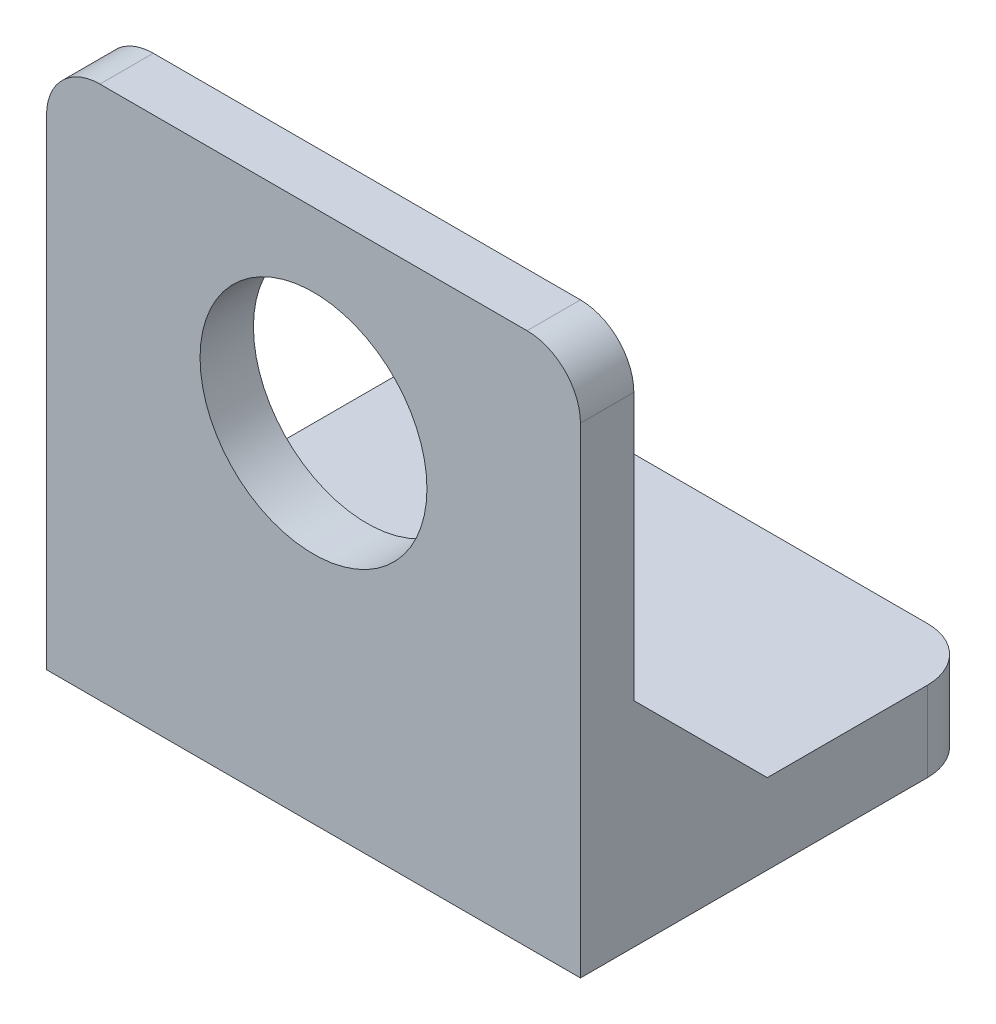
ISO-10303-21;
HEADER;
FILE_DESCRIPTION(('STEP AP214'),'2;1');
FILE_NAME('part.step','',(''),(''),'','','');
FILE_SCHEMA(('AUTOMOTIVE_DESIGN { 1 0 10303 214 1 1 1 1 }'));
ENDSEC;
DATA;
#1=APPLICATION_CONTEXT('core data for automotive mechanical design processes');
#2=APPLICATION_PROTOCOL_DEFINITION('international standard','automotive_design',2000,#1);
#3=PRODUCT_CONTEXT('',#1,'mechanical');
#4=PRODUCT('Part','Part','',(#3));
#5=PRODUCT_RELATED_PRODUCT_CATEGORY('part','',(#4));
#6=PRODUCT_DEFINITION_FORMATION('','',#4);
#7=PRODUCT_DEFINITION_CONTEXT('part definition',#1,'design');
#8=PRODUCT_DEFINITION('design','',#6,#7);
#9=PRODUCT_DEFINITION_SHAPE('','',#8);
#10=(LENGTH_UNIT() NAMED_UNIT(*) SI_UNIT(.MILLI.,.METRE.));
#11=(NAMED_UNIT(*) PLANE_ANGLE_UNIT() SI_UNIT($,.RADIAN.));
#12=(NAMED_UNIT(*) SI_UNIT($,.STERADIAN.) SOLID_ANGLE_UNIT());
#13=UNCERTAINTY_MEASURE_WITH_UNIT(LENGTH_MEASURE(1.E-05),#10,'distance_accuracy_value','');
#14=(GEOMETRIC_REPRESENTATION_CONTEXT(3) GLOBAL_UNCERTAINTY_ASSIGNED_CONTEXT((#13)) GLOBAL_UNIT_ASSIGNED_CONTEXT((#10,
#11,#12)) REPRESENTATION_CONTEXT('',''));
#15=CARTESIAN_POINT('',(0.,0.,0.));
#16=DIRECTION('',(0.,0.,1.));
#17=DIRECTION('',(1.,0.,0.));
#18=AXIS2_PLACEMENT_3D('',#15,#16,#17);
#19=CARTESIAN_POINT('',(0.,0.,-2.));
#20=DIRECTION('',(0.,0.,1.));
#21=DIRECTION('',(1.,0.,0.));
#22=AXIS2_PLACEMENT_3D('',#19,#20,#21);
#23=PLANE('',#22);
#24=CARTESIAN_POINT('',(0.,0.,-2.));
#25=DIRECTION('',(0.,0.,1.));
#26=DIRECTION('',(1.,0.,0.));
#27=AXIS2_PLACEMENT_3D('',#24,#25,#26);
#28=CIRCLE('',#27,4.25);
#29=CARTESIAN_POINT('',(4.25,0.,-2.));
#30=VERTEX_POINT('',#29);
#31=EDGE_CURVE('E231',#30,#30,#28,.T.);
#32=ORIENTED_EDGE('',*,*,#31,.T.);
#33=EDGE_LOOP('',(#32));
#34=FACE_BOUND('',#33,.T.);
#35=DIRECTION('',(0.,-1.,0.));
#36=VECTOR('',#35,1.);
#37=CARTESIAN_POINT('',(-10.,7.,-2.));
#38=LINE('',#37,#36);
#39=CARTESIAN_POINT('',(-10.,5.,-2.));
#40=VERTEX_POINT('',#39);
#41=CARTESIAN_POINT('',(-10.,-5.,-2.));
#42=VERTEX_POINT('',#41);
#43=EDGE_CURVE('E238',#40,#42,#38,.T.);
#44=ORIENTED_EDGE('',*,*,#43,.F.);
#45=CARTESIAN_POINT('',(-8.,5.,-2.));
#46=DIRECTION('',(0.,0.,1.));
#47=DIRECTION('',(1.,0.,0.));
#48=AXIS2_PLACEMENT_3D('',#45,#46,#47);
#49=CIRCLE('',#48,2.);
#50=CARTESIAN_POINT('',(-8.,7.,-2.));
#51=VERTEX_POINT('',#50);
#52=EDGE_CURVE('E190',#40,#51,#49,.F.);
#53=ORIENTED_EDGE('',*,*,#52,.T.);
#54=DIRECTION('',(-1.,0.,0.));
#55=VECTOR('',#54,1.);
#56=CARTESIAN_POINT('',(-10.,7.,-2.));
#57=LINE('',#56,#55);
#58=CARTESIAN_POINT('',(8.,7.,-2.));
#59=VERTEX_POINT('',#58);
#60=EDGE_CURVE('E247',#59,#51,#57,.T.);
#61=ORIENTED_EDGE('',*,*,#60,.F.);
#62=CARTESIAN_POINT('',(8.,5.,-2.));
#63=DIRECTION('',(0.,0.,1.));
#64=DIRECTION('',(1.,0.,0.));
#65=AXIS2_PLACEMENT_3D('',#62,#63,#64);
#66=CIRCLE('',#65,2.);
#67=CARTESIAN_POINT('',(10.,5.,-2.));
#68=VERTEX_POINT('',#67);
#69=EDGE_CURVE('E183',#59,#68,#66,.F.);
#70=ORIENTED_EDGE('',*,*,#69,.T.);
#71=DIRECTION('',(0.,1.,0.));
#72=VECTOR('',#71,1.);
#73=CARTESIAN_POINT('',(10.,7.,-2.));
#74=LINE('',#73,#72);
#75=CARTESIAN_POINT('',(10.,-5.,-2.));
#76=VERTEX_POINT('',#75);
#77=EDGE_CURVE('E245',#76,#68,#74,.T.);
#78=ORIENTED_EDGE('',*,*,#77,.F.);
#79=DIRECTION('',(1.,0.,0.));
#80=VECTOR('',#79,1.);
#81=CARTESIAN_POINT('',(8.,-5.,-2.));
#82=LINE('',#81,#80);
#83=CARTESIAN_POINT('',(8.,-5.,-2.));
#84=VERTEX_POINT('',#83);
#85=EDGE_CURVE('E159',#84,#76,#82,.T.);
#86=ORIENTED_EDGE('',*,*,#85,.F.);
#87=DIRECTION('',(0.,1.,0.));
#88=VECTOR('',#87,1.);
#89=CARTESIAN_POINT('',(8.,-5.,-2.));
#90=LINE('',#89,#88);
#91=CARTESIAN_POINT('',(8.,-10.,-2.));
#92=VERTEX_POINT('',#91);
#93=EDGE_CURVE('E144',#92,#84,#90,.T.);
#94=ORIENTED_EDGE('',*,*,#93,.F.);
#95=DIRECTION('',(-1.,0.,0.));
#96=VECTOR('',#95,1.);
#97=CARTESIAN_POINT('',(0.,-10.,-2.));
#98=LINE('',#97,#96);
#99=CARTESIAN_POINT('',(-8.,-10.,-2.));
#100=VERTEX_POINT('',#99);
#101=EDGE_CURVE('E156',#92,#100,#98,.T.);
#102=ORIENTED_EDGE('',*,*,#101,.T.);
#103=DIRECTION('',(0.,1.,0.));
#104=VECTOR('',#103,1.);
#105=CARTESIAN_POINT('',(-8.,-5.,-2.));
#106=LINE('',#105,#104);
#107=CARTESIAN_POINT('',(-8.,-5.,-2.));
#108=VERTEX_POINT('',#107);
#109=EDGE_CURVE('E281',#100,#108,#106,.T.);
#110=ORIENTED_EDGE('',*,*,#109,.T.);
#111=DIRECTION('',(-1.,0.,0.));
#112=VECTOR('',#111,1.);
#113=CARTESIAN_POINT('',(-8.,-5.,-2.));
#114=LINE('',#113,#112);
#115=EDGE_CURVE('E227',#108,#42,#114,.T.);
#116=ORIENTED_EDGE('',*,*,#115,.T.);
#117=EDGE_LOOP('',(#44,#53,#61,#70,#78,#86,#94,#102,#110,#116));
#118=FACE_BOUND('',#117,.T.);
#119=ADVANCED_FACE('F39',(#34,#118),#23,.F.);
#120=CARTESIAN_POINT('',(-10.,7.,-2.));
#121=DIRECTION('',(-1.,0.,0.));
#122=DIRECTION('',(0.,-1.,0.));
#123=AXIS2_PLACEMENT_3D('',#120,#121,#122);
#124=PLANE('',#123);
#125=DIRECTION('',(0.,0.,1.));
#126=VECTOR('',#125,1.);
#127=CARTESIAN_POINT('',(-10.,-10.,-15.));
#128=LINE('',#127,#126);
#129=CARTESIAN_POINT('',(-10.,-10.,-13.));
#130=VERTEX_POINT('',#129);
#131=CARTESIAN_POINT('',(-10.,-10.,-7.));
#132=VERTEX_POINT('',#131);
#133=EDGE_CURVE('E204',#130,#132,#128,.T.);
#134=ORIENTED_EDGE('',*,*,#133,.F.);
#135=DIRECTION('',(0.,-1.,0.));
#136=VECTOR('',#135,1.);
#137=CARTESIAN_POINT('',(-10.,-13.,-13.));
#138=LINE('',#137,#136);
#139=CARTESIAN_POINT('',(-10.,-13.,-13.));
#140=VERTEX_POINT('',#139);
#141=EDGE_CURVE('E195',#130,#140,#138,.T.);
#142=ORIENTED_EDGE('',*,*,#141,.T.);
#143=DIRECTION('',(0.,0.,1.));
#144=VECTOR('',#143,1.);
#145=CARTESIAN_POINT('',(-10.,-13.,-2.));
#146=LINE('',#145,#144);
#147=CARTESIAN_POINT('',(-10.,-13.,0.));
#148=VERTEX_POINT('',#147);
#149=EDGE_CURVE('E171',#140,#148,#146,.T.);
#150=ORIENTED_EDGE('',*,*,#149,.T.);
#151=DIRECTION('',(0.,-1.,0.));
#152=VECTOR('',#151,1.);
#153=CARTESIAN_POINT('',(-10.,7.,0.));
#154=LINE('',#153,#152);
#155=CARTESIAN_POINT('',(-10.,5.,0.));
#156=VERTEX_POINT('',#155);
#157=EDGE_CURVE('E240',#156,#148,#154,.T.);
#158=ORIENTED_EDGE('',*,*,#157,.F.);
#159=DIRECTION('',(0.,0.,1.));
#160=VECTOR('',#159,1.);
#161=CARTESIAN_POINT('',(-10.,5.,-2.));
#162=LINE('',#161,#160);
#163=EDGE_CURVE('E181',#156,#40,#162,.F.);
#164=ORIENTED_EDGE('',*,*,#163,.T.);
#165=ORIENTED_EDGE('',*,*,#43,.T.);
#166=DIRECTION('',(0.,-0.707106781186547,-0.707106781186548));
#167=VECTOR('',#166,1.);
#168=CARTESIAN_POINT('',(-10.,-10.,-7.));
#169=LINE('',#168,#167);
#170=EDGE_CURVE('E212',#42,#132,#169,.T.);
#171=ORIENTED_EDGE('',*,*,#170,.T.);
#172=EDGE_LOOP('',(#134,#142,#150,#158,#164,#165,#171));
#173=FACE_BOUND('',#172,.T.);
#174=ADVANCED_FACE('F211',(#173),#124,.T.);
#175=CARTESIAN_POINT('',(-10.,7.,-2.));
#176=DIRECTION('',(0.,1.,0.));
#177=DIRECTION('',(0.,0.,1.));
#178=AXIS2_PLACEMENT_3D('',#175,#176,#177);
#179=PLANE('',#178);
#180=ORIENTED_EDGE('',*,*,#60,.T.);
#181=DIRECTION('',(0.,0.,1.));
#182=VECTOR('',#181,1.);
#183=CARTESIAN_POINT('',(-8.,7.,-2.));
#184=LINE('',#183,#182);
#185=CARTESIAN_POINT('',(-8.,7.,0.));
#186=VERTEX_POINT('',#185);
#187=EDGE_CURVE('E173',#51,#186,#184,.T.);
#188=ORIENTED_EDGE('',*,*,#187,.T.);
#189=DIRECTION('',(-1.,0.,0.));
#190=VECTOR('',#189,1.);
#191=CARTESIAN_POINT('',(-10.,7.,0.));
#192=LINE('',#191,#190);
#193=CARTESIAN_POINT('',(8.,7.,0.));
#194=VERTEX_POINT('',#193);
#195=EDGE_CURVE('E241',#194,#186,#192,.T.);
#196=ORIENTED_EDGE('',*,*,#195,.F.);
#197=DIRECTION('',(0.,0.,1.));
#198=VECTOR('',#197,1.);
#199=CARTESIAN_POINT('',(8.,7.,-2.));
#200=LINE('',#199,#198);
#201=EDGE_CURVE('E169',#194,#59,#200,.F.);
#202=ORIENTED_EDGE('',*,*,#201,.T.);
#203=EDGE_LOOP('',(#180,#188,#196,#202));
#204=FACE_BOUND('',#203,.T.);
#205=ADVANCED_FACE('F264',(#204),#179,.T.);
#206=CARTESIAN_POINT('',(10.,7.,-2.));
#207=DIRECTION('',(1.,0.,0.));
#208=DIRECTION('',(0.,1.,0.));
#209=AXIS2_PLACEMENT_3D('',#206,#207,#208);
#210=PLANE('',#209);
#211=DIRECTION('',(0.,0.,1.));
#212=VECTOR('',#211,1.);
#213=CARTESIAN_POINT('',(10.,-13.,-2.));
#214=LINE('',#213,#212);
#215=CARTESIAN_POINT('',(10.,-13.,-13.));
#216=VERTEX_POINT('',#215);
#217=CARTESIAN_POINT('',(10.,-13.,0.));
#218=VERTEX_POINT('',#217);
#219=EDGE_CURVE('E166',#216,#218,#214,.T.);
#220=ORIENTED_EDGE('',*,*,#219,.F.);
#221=DIRECTION('',(0.,1.,0.));
#222=VECTOR('',#221,1.);
#223=CARTESIAN_POINT('',(10.,-10.,-13.));
#224=LINE('',#223,#222);
#225=CARTESIAN_POINT('',(10.,-10.,-13.));
#226=VERTEX_POINT('',#225);
#227=EDGE_CURVE('E11',#216,#226,#224,.T.);
#228=ORIENTED_EDGE('',*,*,#227,.T.);
#229=DIRECTION('',(0.,0.,1.));
#230=VECTOR('',#229,1.);
#231=CARTESIAN_POINT('',(10.,-10.,-15.));
#232=LINE('',#231,#230);
#233=CARTESIAN_POINT('',(10.,-10.,-7.));
#234=VERTEX_POINT('',#233);
#235=EDGE_CURVE('E216',#226,#234,#232,.T.);
#236=ORIENTED_EDGE('',*,*,#235,.T.);
#237=DIRECTION('',(0.,-0.707106781186547,-0.707106781186548));
#238=VECTOR('',#237,1.);
#239=CARTESIAN_POINT('',(10.,-10.,-7.));
#240=LINE('',#239,#238);
#241=EDGE_CURVE('E161',#76,#234,#240,.T.);
#242=ORIENTED_EDGE('',*,*,#241,.F.);
#243=ORIENTED_EDGE('',*,*,#77,.T.);
#244=DIRECTION('',(0.,0.,1.));
#245=VECTOR('',#244,1.);
#246=CARTESIAN_POINT('',(10.,5.,-2.));
#247=LINE('',#246,#245);
#248=CARTESIAN_POINT('',(10.,5.,0.));
#249=VERTEX_POINT('',#248);
#250=EDGE_CURVE('E187',#68,#249,#247,.T.);
#251=ORIENTED_EDGE('',*,*,#250,.T.);
#252=DIRECTION('',(0.,1.,0.));
#253=VECTOR('',#252,1.);
#254=CARTESIAN_POINT('',(10.,7.,0.));
#255=LINE('',#254,#253);
#256=EDGE_CURVE('E255',#218,#249,#255,.T.);
#257=ORIENTED_EDGE('',*,*,#256,.F.);
#258=EDGE_LOOP('',(#220,#228,#236,#242,#243,#251,#257));
#259=FACE_BOUND('',#258,.T.);
#260=ADVANCED_FACE('F273',(#259),#210,.T.);
#261=CARTESIAN_POINT('',(-10.,-13.,-2.));
#262=DIRECTION('',(0.,-1.,0.));
#263=DIRECTION('',(0.,0.,-1.));
#264=AXIS2_PLACEMENT_3D('',#261,#262,#263);
#265=PLANE('',#264);
#266=ORIENTED_EDGE('',*,*,#149,.F.);
#267=CARTESIAN_POINT('',(-8.,-13.,-13.));
#268=DIRECTION('',(0.,-1.,0.));
#269=DIRECTION('',(0.,0.,-1.));
#270=AXIS2_PLACEMENT_3D('',#267,#268,#269);
#271=CIRCLE('',#270,2.);
#272=CARTESIAN_POINT('',(-8.,-13.,-15.));
#273=VERTEX_POINT('',#272);
#274=EDGE_CURVE('E197',#140,#273,#271,.T.);
#275=ORIENTED_EDGE('',*,*,#274,.T.);
#276=DIRECTION('',(1.,0.,0.));
#277=VECTOR('',#276,1.);
#278=CARTESIAN_POINT('',(0.,-13.,-15.));
#279=LINE('',#278,#277);
#280=CARTESIAN_POINT('',(8.,-13.,-15.));
#281=VERTEX_POINT('',#280);
#282=EDGE_CURVE('E225',#273,#281,#279,.T.);
#283=ORIENTED_EDGE('',*,*,#282,.T.);
#284=CARTESIAN_POINT('',(8.,-13.,-13.));
#285=DIRECTION('',(0.,-1.,0.));
#286=DIRECTION('',(0.,0.,-1.));
#287=AXIS2_PLACEMENT_3D('',#284,#285,#286);
#288=CIRCLE('',#287,2.);
#289=EDGE_CURVE('E193',#281,#216,#288,.T.);
#290=ORIENTED_EDGE('',*,*,#289,.T.);
#291=ORIENTED_EDGE('',*,*,#219,.T.);
#292=DIRECTION('',(1.,0.,0.));
#293=VECTOR('',#292,1.);
#294=CARTESIAN_POINT('',(-10.,-13.,0.));
#295=LINE('',#294,#293);
#296=EDGE_CURVE('E253',#148,#218,#295,.T.);
#297=ORIENTED_EDGE('',*,*,#296,.F.);
#298=EDGE_LOOP('',(#266,#275,#283,#290,#291,#297));
#299=FACE_BOUND('',#298,.T.);
#300=ADVANCED_FACE('F222',(#299),#265,.T.);
#301=CARTESIAN_POINT('',(0.,0.,0.));
#302=DIRECTION('',(0.,0.,1.));
#303=DIRECTION('',(1.,0.,0.));
#304=AXIS2_PLACEMENT_3D('',#301,#302,#303);
#305=PLANE('',#304);
#306=ORIENTED_EDGE('',*,*,#195,.T.);
#307=CARTESIAN_POINT('',(-8.,5.,0.));
#308=DIRECTION('',(0.,0.,1.));
#309=DIRECTION('',(1.,0.,0.));
#310=AXIS2_PLACEMENT_3D('',#307,#308,#309);
#311=CIRCLE('',#310,2.);
#312=EDGE_CURVE('E182',#186,#156,#311,.T.);
#313=ORIENTED_EDGE('',*,*,#312,.T.);
#314=ORIENTED_EDGE('',*,*,#157,.T.);
#315=ORIENTED_EDGE('',*,*,#296,.T.);
#316=ORIENTED_EDGE('',*,*,#256,.T.);
#317=CARTESIAN_POINT('',(8.,5.,0.));
#318=DIRECTION('',(0.,0.,1.));
#319=DIRECTION('',(1.,0.,0.));
#320=AXIS2_PLACEMENT_3D('',#317,#318,#319);
#321=CIRCLE('',#320,2.);
#322=EDGE_CURVE('E176',#249,#194,#321,.T.);
#323=ORIENTED_EDGE('',*,*,#322,.T.);
#324=EDGE_LOOP('',(#306,#313,#314,#315,#316,#323));
#325=FACE_BOUND('',#324,.T.);
#326=CARTESIAN_POINT('',(0.,0.,0.));
#327=DIRECTION('',(0.,0.,1.));
#328=DIRECTION('',(1.,0.,0.));
#329=AXIS2_PLACEMENT_3D('',#326,#327,#328);
#330=CIRCLE('',#329,4.25);
#331=CARTESIAN_POINT('',(4.25,0.,0.));
#332=VERTEX_POINT('',#331);
#333=EDGE_CURVE('E214',#332,#332,#330,.T.);
#334=ORIENTED_EDGE('',*,*,#333,.F.);
#335=EDGE_LOOP('',(#334));
#336=FACE_BOUND('',#335,.T.);
#337=ADVANCED_FACE('F257',(#325,#336),#305,.T.);
#338=CARTESIAN_POINT('',(0.,0.,-2.));
#339=DIRECTION('',(0.,0.,1.));
#340=DIRECTION('',(1.,0.,0.));
#341=AXIS2_PLACEMENT_3D('',#338,#339,#340);
#342=CYLINDRICAL_SURFACE('',#341,4.25);
#343=ORIENTED_EDGE('',*,*,#31,.F.);
#344=EDGE_LOOP('',(#343));
#345=FACE_BOUND('',#344,.T.);
#346=ORIENTED_EDGE('',*,*,#333,.T.);
#347=EDGE_LOOP('',(#346));
#348=FACE_BOUND('',#347,.T.);
#349=ADVANCED_FACE('F320',(#345,#348),#342,.F.);
#350=CARTESIAN_POINT('',(0.,-10.,-15.));
#351=DIRECTION('',(0.,1.,0.));
#352=DIRECTION('',(0.,0.,1.));
#353=AXIS2_PLACEMENT_3D('',#350,#351,#352);
#354=PLANE('',#353);
#355=DIRECTION('',(-1.,0.,0.));
#356=VECTOR('',#355,1.);
#357=CARTESIAN_POINT('',(0.,-10.,-15.));
#358=LINE('',#357,#356);
#359=CARTESIAN_POINT('',(8.,-10.,-15.));
#360=VERTEX_POINT('',#359);
#361=CARTESIAN_POINT('',(-8.,-10.,-15.));
#362=VERTEX_POINT('',#361);
#363=EDGE_CURVE('E206',#360,#362,#358,.T.);
#364=ORIENTED_EDGE('',*,*,#363,.T.);
#365=CARTESIAN_POINT('',(-8.,-10.,-13.));
#366=DIRECTION('',(0.,1.,0.));
#367=DIRECTION('',(0.,0.,1.));
#368=AXIS2_PLACEMENT_3D('',#365,#366,#367);
#369=CIRCLE('',#368,2.);
#370=EDGE_CURVE('E50',#362,#130,#369,.T.);
#371=ORIENTED_EDGE('',*,*,#370,.T.);
#372=ORIENTED_EDGE('',*,*,#133,.T.);
#373=DIRECTION('',(-1.,0.,0.));
#374=VECTOR('',#373,1.);
#375=CARTESIAN_POINT('',(-8.,-10.,-7.));
#376=LINE('',#375,#374);
#377=CARTESIAN_POINT('',(-8.,-10.,-7.));
#378=VERTEX_POINT('',#377);
#379=EDGE_CURVE('E228',#378,#132,#376,.T.);
#380=ORIENTED_EDGE('',*,*,#379,.F.);
#381=DIRECTION('',(0.,0.,1.));
#382=VECTOR('',#381,1.);
#383=CARTESIAN_POINT('',(-8.,-10.,-2.));
#384=LINE('',#383,#382);
#385=EDGE_CURVE('E170',#378,#100,#384,.T.);
#386=ORIENTED_EDGE('',*,*,#385,.T.);
#387=ORIENTED_EDGE('',*,*,#101,.F.);
#388=DIRECTION('',(0.,0.,1.));
#389=VECTOR('',#388,1.);
#390=CARTESIAN_POINT('',(8.,-10.,-2.));
#391=LINE('',#390,#389);
#392=CARTESIAN_POINT('',(8.,-10.,-7.));
#393=VERTEX_POINT('',#392);
#394=EDGE_CURVE('E142',#393,#92,#391,.T.);
#395=ORIENTED_EDGE('',*,*,#394,.F.);
#396=DIRECTION('',(1.,0.,0.));
#397=VECTOR('',#396,1.);
#398=CARTESIAN_POINT('',(8.,-10.,-7.));
#399=LINE('',#398,#397);
#400=EDGE_CURVE('E283',#393,#234,#399,.T.);
#401=ORIENTED_EDGE('',*,*,#400,.T.);
#402=ORIENTED_EDGE('',*,*,#235,.F.);
#403=CARTESIAN_POINT('',(8.,-10.,-13.));
#404=DIRECTION('',(0.,1.,0.));
#405=DIRECTION('',(0.,0.,1.));
#406=AXIS2_PLACEMENT_3D('',#403,#404,#405);
#407=CIRCLE('',#406,2.);
#408=EDGE_CURVE('E53',#226,#360,#407,.T.);
#409=ORIENTED_EDGE('',*,*,#408,.T.);
#410=EDGE_LOOP('',(#364,#371,#372,#380,#386,#387,#395,#401,#402,#409));
#411=FACE_BOUND('',#410,.T.);
#412=ADVANCED_FACE('F163',(#411),#354,.T.);
#413=CARTESIAN_POINT('',(0.,0.,-15.));
#414=DIRECTION('',(0.,0.,1.));
#415=DIRECTION('',(1.,0.,0.));
#416=AXIS2_PLACEMENT_3D('',#413,#414,#415);
#417=PLANE('',#416);
#418=ORIENTED_EDGE('',*,*,#282,.F.);
#419=DIRECTION('',(0.,-1.,0.));
#420=VECTOR('',#419,1.);
#421=CARTESIAN_POINT('',(-8.,-10.,-15.));
#422=LINE('',#421,#420);
#423=EDGE_CURVE('E63',#273,#362,#422,.F.);
#424=ORIENTED_EDGE('',*,*,#423,.T.);
#425=ORIENTED_EDGE('',*,*,#363,.F.);
#426=DIRECTION('',(0.,1.,0.));
#427=VECTOR('',#426,1.);
#428=CARTESIAN_POINT('',(8.,-13.,-15.));
#429=LINE('',#428,#427);
#430=EDGE_CURVE('E200',#360,#281,#429,.F.);
#431=ORIENTED_EDGE('',*,*,#430,.T.);
#432=EDGE_LOOP('',(#418,#424,#425,#431));
#433=FACE_BOUND('',#432,.T.);
#434=ADVANCED_FACE('F223',(#433),#417,.F.);
#435=CARTESIAN_POINT('',(-8.,-10.,-7.));
#436=DIRECTION('',(0.,0.707106781186548,-0.707106781186547));
#437=DIRECTION('',(0.,0.707106781186547,0.707106781186548));
#438=AXIS2_PLACEMENT_3D('',#435,#436,#437);
#439=PLANE('',#438);
#440=ORIENTED_EDGE('',*,*,#170,.F.);
#441=ORIENTED_EDGE('',*,*,#115,.F.);
#442=DIRECTION('',(0.,-0.707106781186547,-0.707106781186548));
#443=VECTOR('',#442,1.);
#444=CARTESIAN_POINT('',(-8.,-10.,-7.));
#445=LINE('',#444,#443);
#446=EDGE_CURVE('E286',#108,#378,#445,.T.);
#447=ORIENTED_EDGE('',*,*,#446,.T.);
#448=ORIENTED_EDGE('',*,*,#379,.T.);
#449=EDGE_LOOP('',(#440,#441,#447,#448));
#450=FACE_BOUND('',#449,.T.);
#451=ADVANCED_FACE('F293',(#450),#439,.T.);
#452=CARTESIAN_POINT('',(-8.,0.,0.));
#453=DIRECTION('',(1.,0.,0.));
#454=DIRECTION('',(0.,1.,0.));
#455=AXIS2_PLACEMENT_3D('',#452,#453,#454);
#456=PLANE('',#455);
#457=ORIENTED_EDGE('',*,*,#109,.F.);
#458=ORIENTED_EDGE('',*,*,#385,.F.);
#459=ORIENTED_EDGE('',*,*,#446,.F.);
#460=EDGE_LOOP('',(#457,#458,#459));
#461=FACE_BOUND('',#460,.T.);
#462=ADVANCED_FACE('F300',(#461),#456,.T.);
#463=CARTESIAN_POINT('',(8.,-10.,-7.));
#464=DIRECTION('',(0.,-0.707106781186548,0.707106781186547));
#465=DIRECTION('',(0.,-0.707106781186547,-0.707106781186548));
#466=AXIS2_PLACEMENT_3D('',#463,#464,#465);
#467=PLANE('',#466);
#468=ORIENTED_EDGE('',*,*,#241,.T.);
#469=ORIENTED_EDGE('',*,*,#400,.F.);
#470=DIRECTION('',(0.,-0.707106781186547,-0.707106781186548));
#471=VECTOR('',#470,1.);
#472=CARTESIAN_POINT('',(8.,-10.,-7.));
#473=LINE('',#472,#471);
#474=EDGE_CURVE('E150',#84,#393,#473,.T.);
#475=ORIENTED_EDGE('',*,*,#474,.F.);
#476=ORIENTED_EDGE('',*,*,#85,.T.);
#477=EDGE_LOOP('',(#468,#469,#475,#476));
#478=FACE_BOUND('',#477,.T.);
#479=ADVANCED_FACE('F278',(#478),#467,.F.);
#480=CARTESIAN_POINT('',(8.,0.,0.));
#481=DIRECTION('',(-1.,0.,0.));
#482=DIRECTION('',(0.,1.,0.));
#483=AXIS2_PLACEMENT_3D('',#480,#481,#482);
#484=PLANE('',#483);
#485=ORIENTED_EDGE('',*,*,#93,.T.);
#486=ORIENTED_EDGE('',*,*,#474,.T.);
#487=ORIENTED_EDGE('',*,*,#394,.T.);
#488=EDGE_LOOP('',(#485,#486,#487));
#489=FACE_BOUND('',#488,.T.);
#490=ADVANCED_FACE('F145',(#489),#484,.T.);
#491=CARTESIAN_POINT('',(-8.,5.,-2.));
#492=DIRECTION('',(0.,0.,1.));
#493=DIRECTION('',(1.,0.,0.));
#494=AXIS2_PLACEMENT_3D('',#491,#492,#493);
#495=CYLINDRICAL_SURFACE('',#494,2.);
#496=ORIENTED_EDGE('',*,*,#52,.F.);
#497=ORIENTED_EDGE('',*,*,#163,.F.);
#498=ORIENTED_EDGE('',*,*,#312,.F.);
#499=ORIENTED_EDGE('',*,*,#187,.F.);
#500=EDGE_LOOP('',(#496,#497,#498,#499));
#501=FACE_BOUND('',#500,.T.);
#502=ADVANCED_FACE('F326',(#501),#495,.T.);
#503=CARTESIAN_POINT('',(8.,5.,-2.));
#504=DIRECTION('',(0.,0.,1.));
#505=DIRECTION('',(1.,0.,0.));
#506=AXIS2_PLACEMENT_3D('',#503,#504,#505);
#507=CYLINDRICAL_SURFACE('',#506,2.);
#508=ORIENTED_EDGE('',*,*,#69,.F.);
#509=ORIENTED_EDGE('',*,*,#201,.F.);
#510=ORIENTED_EDGE('',*,*,#322,.F.);
#511=ORIENTED_EDGE('',*,*,#250,.F.);
#512=EDGE_LOOP('',(#508,#509,#510,#511));
#513=FACE_BOUND('',#512,.T.);
#514=ADVANCED_FACE('F269',(#513),#507,.T.);
#515=CARTESIAN_POINT('',(-8.,7.,-13.));
#516=DIRECTION('',(0.,1.,0.));
#517=DIRECTION('',(-1.,0.,0.));
#518=AXIS2_PLACEMENT_3D('',#515,#516,#517);
#519=CYLINDRICAL_SURFACE('',#518,2.);
#520=ORIENTED_EDGE('',*,*,#370,.F.);
#521=ORIENTED_EDGE('',*,*,#423,.F.);
#522=ORIENTED_EDGE('',*,*,#274,.F.);
#523=ORIENTED_EDGE('',*,*,#141,.F.);
#524=EDGE_LOOP('',(#520,#521,#522,#523));
#525=FACE_BOUND('',#524,.T.);
#526=ADVANCED_FACE('F217',(#525),#519,.T.);
#527=CARTESIAN_POINT('',(8.,7.,-13.));
#528=DIRECTION('',(0.,-1.,0.));
#529=DIRECTION('',(1.,0.,0.));
#530=AXIS2_PLACEMENT_3D('',#527,#528,#529);
#531=CYLINDRICAL_SURFACE('',#530,2.);
#532=ORIENTED_EDGE('',*,*,#289,.F.);
#533=ORIENTED_EDGE('',*,*,#430,.F.);
#534=ORIENTED_EDGE('',*,*,#408,.F.);
#535=ORIENTED_EDGE('',*,*,#227,.F.);
#536=EDGE_LOOP('',(#532,#533,#534,#535));
#537=FACE_BOUND('',#536,.T.);
#538=ADVANCED_FACE('F41',(#537),#531,.T.);
#539=CLOSED_SHELL('',(#119,#174,#205,#260,#300,#337,#349,#412,#434,#451,#462,#479,#490,#502,
#514,#526,#538));
#540=MANIFOLD_SOLID_BREP('B2',#539);
#541=ADVANCED_BREP_SHAPE_REPRESENTATION('',(#18,#540),#14);
#542=SHAPE_DEFINITION_REPRESENTATION(#9,#541);
ENDSEC;
END-ISO-10303-21;
